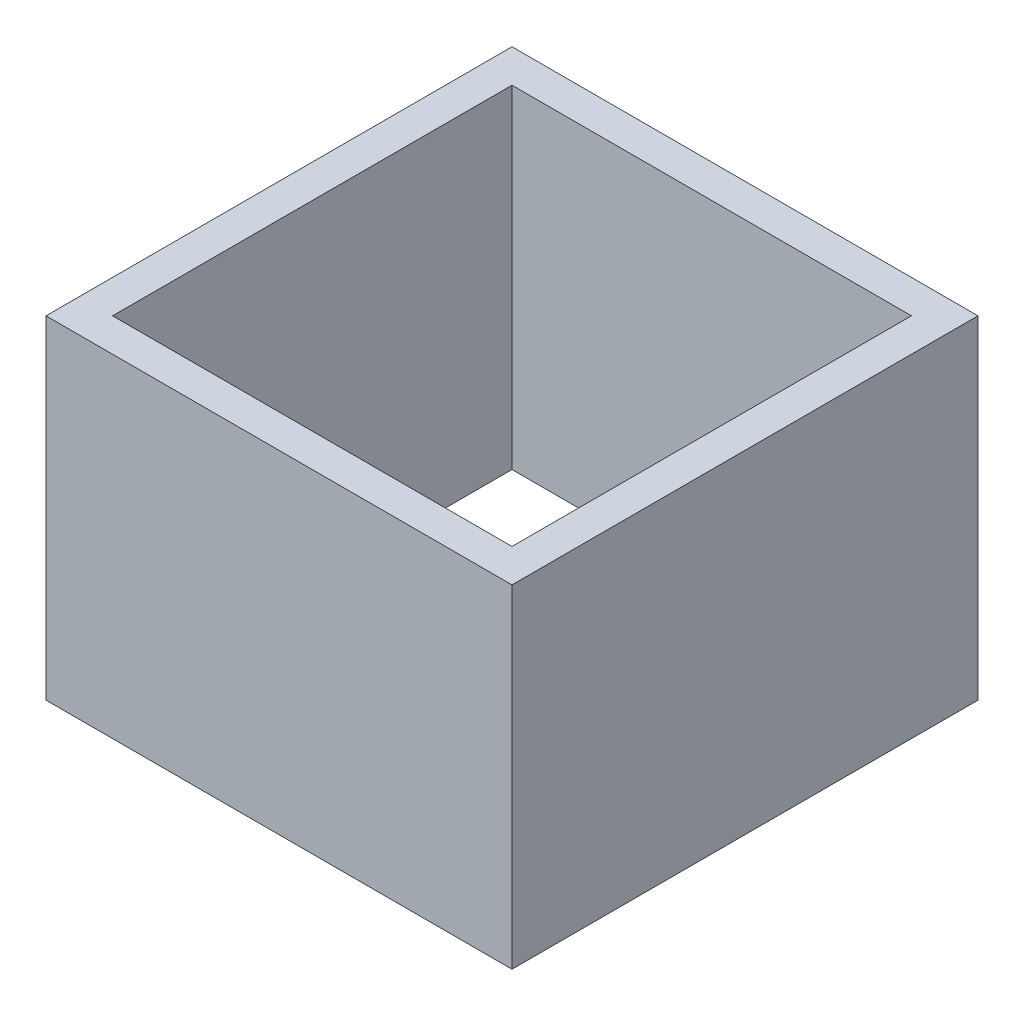
ISO-10303-21;
HEADER;
FILE_DESCRIPTION(('STEP AP214'),'2;1');
FILE_NAME('part.step','',(''),(''),'','','');
FILE_SCHEMA(('AUTOMOTIVE_DESIGN { 1 0 10303 214 1 1 1 1 }'));
ENDSEC;
DATA;
#1=APPLICATION_CONTEXT('core data for automotive mechanical design processes');
#2=APPLICATION_PROTOCOL_DEFINITION('international standard','automotive_design',2000,#1);
#3=PRODUCT_CONTEXT('',#1,'mechanical');
#4=PRODUCT('Part','Part','',(#3));
#5=PRODUCT_RELATED_PRODUCT_CATEGORY('part','',(#4));
#6=PRODUCT_DEFINITION_FORMATION('','',#4);
#7=PRODUCT_DEFINITION_CONTEXT('part definition',#1,'design');
#8=PRODUCT_DEFINITION('design','',#6,#7);
#9=PRODUCT_DEFINITION_SHAPE('','',#8);
#10=(LENGTH_UNIT() NAMED_UNIT(*) SI_UNIT(.MILLI.,.METRE.));
#11=(NAMED_UNIT(*) PLANE_ANGLE_UNIT() SI_UNIT($,.RADIAN.));
#12=(NAMED_UNIT(*) SI_UNIT($,.STERADIAN.) SOLID_ANGLE_UNIT());
#13=UNCERTAINTY_MEASURE_WITH_UNIT(LENGTH_MEASURE(1.E-05),#10,'distance_accuracy_value','');
#14=(GEOMETRIC_REPRESENTATION_CONTEXT(3) GLOBAL_UNCERTAINTY_ASSIGNED_CONTEXT((#13)) GLOBAL_UNIT_ASSIGNED_CONTEXT((#10,
#11,#12)) REPRESENTATION_CONTEXT('',''));
#15=CARTESIAN_POINT('',(0.,0.,0.));
#16=DIRECTION('',(0.,0.,1.));
#17=DIRECTION('',(1.,0.,0.));
#18=AXIS2_PLACEMENT_3D('',#15,#16,#17);
#19=CARTESIAN_POINT('',(0.,63.5,0.));
#20=DIRECTION('',(0.,1.,0.));
#21=DIRECTION('',(0.,0.,1.));
#22=AXIS2_PLACEMENT_3D('',#19,#20,#21);
#23=PLANE('',#22);
#24=DIRECTION('',(0.,0.,-1.));
#25=VECTOR('',#24,1.);
#26=CARTESIAN_POINT('',(44.45,63.5,-44.45));
#27=LINE('',#26,#25);
#28=CARTESIAN_POINT('',(44.45,63.5,44.45));
#29=VERTEX_POINT('',#28);
#30=CARTESIAN_POINT('',(44.45,63.5,-44.45));
#31=VERTEX_POINT('',#30);
#32=EDGE_CURVE('E134',#29,#31,#27,.T.);
#33=ORIENTED_EDGE('',*,*,#32,.T.);
#34=DIRECTION('',(-1.,0.,0.));
#35=VECTOR('',#34,1.);
#36=CARTESIAN_POINT('',(-44.45,63.5,-44.45));
#37=LINE('',#36,#35);
#38=CARTESIAN_POINT('',(-44.45,63.5,-44.45));
#39=VERTEX_POINT('',#38);
#40=EDGE_CURVE('E137',#31,#39,#37,.T.);
#41=ORIENTED_EDGE('',*,*,#40,.T.);
#42=DIRECTION('',(0.,0.,1.));
#43=VECTOR('',#42,1.);
#44=CARTESIAN_POINT('',(-44.45,63.5,-44.45));
#45=LINE('',#44,#43);
#46=CARTESIAN_POINT('',(-44.45,63.5,44.45));
#47=VERTEX_POINT('',#46);
#48=EDGE_CURVE('E140',#39,#47,#45,.T.);
#49=ORIENTED_EDGE('',*,*,#48,.T.);
#50=DIRECTION('',(1.,0.,0.));
#51=VECTOR('',#50,1.);
#52=CARTESIAN_POINT('',(-44.45,63.5,44.45));
#53=LINE('',#52,#51);
#54=EDGE_CURVE('E142',#47,#29,#53,.T.);
#55=ORIENTED_EDGE('',*,*,#54,.T.);
#56=EDGE_LOOP('',(#33,#41,#49,#55));
#57=FACE_BOUND('',#56,.T.);
#58=DIRECTION('',(-1.,0.,0.));
#59=VECTOR('',#58,1.);
#60=CARTESIAN_POINT('',(-38.1,63.5,-38.1));
#61=LINE('',#60,#59);
#62=CARTESIAN_POINT('',(38.1,63.5,-38.1));
#63=VERTEX_POINT('',#62);
#64=CARTESIAN_POINT('',(-38.1,63.5,-38.1));
#65=VERTEX_POINT('',#64);
#66=EDGE_CURVE('E106',#63,#65,#61,.T.);
#67=ORIENTED_EDGE('',*,*,#66,.F.);
#68=DIRECTION('',(0.,0.,-1.));
#69=VECTOR('',#68,1.);
#70=CARTESIAN_POINT('',(38.1,63.5,-38.1));
#71=LINE('',#70,#69);
#72=CARTESIAN_POINT('',(38.1,63.5,38.1));
#73=VERTEX_POINT('',#72);
#74=EDGE_CURVE('E98',#73,#63,#71,.T.);
#75=ORIENTED_EDGE('',*,*,#74,.F.);
#76=DIRECTION('',(1.,0.,0.));
#77=VECTOR('',#76,1.);
#78=CARTESIAN_POINT('',(-38.1,63.5,38.1));
#79=LINE('',#78,#77);
#80=CARTESIAN_POINT('',(-38.1,63.5,38.1));
#81=VERTEX_POINT('',#80);
#82=EDGE_CURVE('E120',#81,#73,#79,.T.);
#83=ORIENTED_EDGE('',*,*,#82,.F.);
#84=DIRECTION('',(0.,0.,1.));
#85=VECTOR('',#84,1.);
#86=CARTESIAN_POINT('',(-38.1,63.5,-38.1));
#87=LINE('',#86,#85);
#88=EDGE_CURVE('E118',#65,#81,#87,.T.);
#89=ORIENTED_EDGE('',*,*,#88,.F.);
#90=EDGE_LOOP('',(#67,#75,#83,#89));
#91=FACE_BOUND('',#90,.T.);
#92=ADVANCED_FACE('F33',(#57,#91),#23,.T.);
#93=CARTESIAN_POINT('',(0.,0.,0.));
#94=DIRECTION('',(0.,1.,0.));
#95=DIRECTION('',(0.,0.,1.));
#96=AXIS2_PLACEMENT_3D('',#93,#94,#95);
#97=PLANE('',#96);
#98=DIRECTION('',(0.,0.,-1.));
#99=VECTOR('',#98,1.);
#100=CARTESIAN_POINT('',(44.45,0.,-44.45));
#101=LINE('',#100,#99);
#102=CARTESIAN_POINT('',(44.45,0.,44.45));
#103=VERTEX_POINT('',#102);
#104=CARTESIAN_POINT('',(44.45,0.,-44.45));
#105=VERTEX_POINT('',#104);
#106=EDGE_CURVE('E114',#103,#105,#101,.T.);
#107=ORIENTED_EDGE('',*,*,#106,.F.);
#108=DIRECTION('',(1.,0.,0.));
#109=VECTOR('',#108,1.);
#110=CARTESIAN_POINT('',(-44.45,0.,44.45));
#111=LINE('',#110,#109);
#112=CARTESIAN_POINT('',(-44.45,0.,44.45));
#113=VERTEX_POINT('',#112);
#114=EDGE_CURVE('E138',#113,#103,#111,.T.);
#115=ORIENTED_EDGE('',*,*,#114,.F.);
#116=DIRECTION('',(0.,0.,1.));
#117=VECTOR('',#116,1.);
#118=CARTESIAN_POINT('',(-44.45,0.,-44.45));
#119=LINE('',#118,#117);
#120=CARTESIAN_POINT('',(-44.45,0.,-44.45));
#121=VERTEX_POINT('',#120);
#122=EDGE_CURVE('E149',#121,#113,#119,.T.);
#123=ORIENTED_EDGE('',*,*,#122,.F.);
#124=DIRECTION('',(-1.,0.,0.));
#125=VECTOR('',#124,1.);
#126=CARTESIAN_POINT('',(-44.45,0.,-44.45));
#127=LINE('',#126,#125);
#128=EDGE_CURVE('E147',#105,#121,#127,.T.);
#129=ORIENTED_EDGE('',*,*,#128,.F.);
#130=EDGE_LOOP('',(#107,#115,#123,#129));
#131=FACE_BOUND('',#130,.T.);
#132=DIRECTION('',(0.,0.,-1.));
#133=VECTOR('',#132,1.);
#134=CARTESIAN_POINT('',(38.1,0.,-38.1));
#135=LINE('',#134,#133);
#136=CARTESIAN_POINT('',(38.1,0.,38.1));
#137=VERTEX_POINT('',#136);
#138=CARTESIAN_POINT('',(38.1,0.,-38.1));
#139=VERTEX_POINT('',#138);
#140=EDGE_CURVE('E56',#137,#139,#135,.T.);
#141=ORIENTED_EDGE('',*,*,#140,.T.);
#142=DIRECTION('',(-1.,0.,0.));
#143=VECTOR('',#142,1.);
#144=CARTESIAN_POINT('',(-38.1,0.,-38.1));
#145=LINE('',#144,#143);
#146=CARTESIAN_POINT('',(-38.1,0.,-38.1));
#147=VERTEX_POINT('',#146);
#148=EDGE_CURVE('E113',#139,#147,#145,.T.);
#149=ORIENTED_EDGE('',*,*,#148,.T.);
#150=DIRECTION('',(0.,0.,1.));
#151=VECTOR('',#150,1.);
#152=CARTESIAN_POINT('',(-38.1,0.,-38.1));
#153=LINE('',#152,#151);
#154=CARTESIAN_POINT('',(-38.1,0.,38.1));
#155=VERTEX_POINT('',#154);
#156=EDGE_CURVE('E126',#147,#155,#153,.T.);
#157=ORIENTED_EDGE('',*,*,#156,.T.);
#158=DIRECTION('',(1.,0.,0.));
#159=VECTOR('',#158,1.);
#160=CARTESIAN_POINT('',(-38.1,0.,38.1));
#161=LINE('',#160,#159);
#162=EDGE_CURVE('E107',#155,#137,#161,.T.);
#163=ORIENTED_EDGE('',*,*,#162,.T.);
#164=EDGE_LOOP('',(#141,#149,#157,#163));
#165=FACE_BOUND('',#164,.T.);
#166=ADVANCED_FACE('F167',(#131,#165),#97,.F.);
#167=CARTESIAN_POINT('',(44.45,63.5,-44.45));
#168=DIRECTION('',(-1.,0.,0.));
#169=DIRECTION('',(0.,0.,1.));
#170=AXIS2_PLACEMENT_3D('',#167,#168,#169);
#171=PLANE('',#170);
#172=ORIENTED_EDGE('',*,*,#106,.T.);
#173=DIRECTION('',(0.,-1.,0.));
#174=VECTOR('',#173,1.);
#175=CARTESIAN_POINT('',(44.45,63.5,-44.45));
#176=LINE('',#175,#174);
#177=EDGE_CURVE('E11',#31,#105,#176,.T.);
#178=ORIENTED_EDGE('',*,*,#177,.F.);
#179=ORIENTED_EDGE('',*,*,#32,.F.);
#180=DIRECTION('',(0.,-1.,0.));
#181=VECTOR('',#180,1.);
#182=CARTESIAN_POINT('',(44.45,63.5,44.45));
#183=LINE('',#182,#181);
#184=EDGE_CURVE('E144',#29,#103,#183,.T.);
#185=ORIENTED_EDGE('',*,*,#184,.T.);
#186=EDGE_LOOP('',(#172,#178,#179,#185));
#187=FACE_BOUND('',#186,.T.);
#188=ADVANCED_FACE('F35',(#187),#171,.F.);
#189=CARTESIAN_POINT('',(-44.45,63.5,-44.45));
#190=DIRECTION('',(0.,0.,1.));
#191=DIRECTION('',(1.,0.,0.));
#192=AXIS2_PLACEMENT_3D('',#189,#190,#191);
#193=PLANE('',#192);
#194=ORIENTED_EDGE('',*,*,#128,.T.);
#195=DIRECTION('',(0.,-1.,0.));
#196=VECTOR('',#195,1.);
#197=CARTESIAN_POINT('',(-44.45,63.5,-44.45));
#198=LINE('',#197,#196);
#199=EDGE_CURVE('E41',#39,#121,#198,.T.);
#200=ORIENTED_EDGE('',*,*,#199,.F.);
#201=ORIENTED_EDGE('',*,*,#40,.F.);
#202=ORIENTED_EDGE('',*,*,#177,.T.);
#203=EDGE_LOOP('',(#194,#200,#201,#202));
#204=FACE_BOUND('',#203,.T.);
#205=ADVANCED_FACE('F177',(#204),#193,.F.);
#206=CARTESIAN_POINT('',(-44.45,63.5,-44.45));
#207=DIRECTION('',(1.,0.,0.));
#208=DIRECTION('',(0.,0.,-1.));
#209=AXIS2_PLACEMENT_3D('',#206,#207,#208);
#210=PLANE('',#209);
#211=ORIENTED_EDGE('',*,*,#122,.T.);
#212=DIRECTION('',(0.,-1.,0.));
#213=VECTOR('',#212,1.);
#214=CARTESIAN_POINT('',(-44.45,63.5,44.45));
#215=LINE('',#214,#213);
#216=EDGE_CURVE('E154',#47,#113,#215,.T.);
#217=ORIENTED_EDGE('',*,*,#216,.F.);
#218=ORIENTED_EDGE('',*,*,#48,.F.);
#219=ORIENTED_EDGE('',*,*,#199,.T.);
#220=EDGE_LOOP('',(#211,#217,#218,#219));
#221=FACE_BOUND('',#220,.T.);
#222=ADVANCED_FACE('F161',(#221),#210,.F.);
#223=CARTESIAN_POINT('',(-44.45,63.5,44.45));
#224=DIRECTION('',(0.,0.,-1.));
#225=DIRECTION('',(-1.,0.,0.));
#226=AXIS2_PLACEMENT_3D('',#223,#224,#225);
#227=PLANE('',#226);
#228=ORIENTED_EDGE('',*,*,#114,.T.);
#229=ORIENTED_EDGE('',*,*,#184,.F.);
#230=ORIENTED_EDGE('',*,*,#54,.F.);
#231=ORIENTED_EDGE('',*,*,#216,.T.);
#232=EDGE_LOOP('',(#228,#229,#230,#231));
#233=FACE_BOUND('',#232,.T.);
#234=ADVANCED_FACE('F171',(#233),#227,.F.);
#235=CARTESIAN_POINT('',(38.1,63.5,-38.1));
#236=DIRECTION('',(-1.,0.,0.));
#237=DIRECTION('',(0.,0.,1.));
#238=AXIS2_PLACEMENT_3D('',#235,#236,#237);
#239=PLANE('',#238);
#240=ORIENTED_EDGE('',*,*,#140,.F.);
#241=DIRECTION('',(0.,-1.,0.));
#242=VECTOR('',#241,1.);
#243=CARTESIAN_POINT('',(38.1,63.5,38.1));
#244=LINE('',#243,#242);
#245=EDGE_CURVE('E102',#73,#137,#244,.T.);
#246=ORIENTED_EDGE('',*,*,#245,.F.);
#247=ORIENTED_EDGE('',*,*,#74,.T.);
#248=DIRECTION('',(0.,-1.,0.));
#249=VECTOR('',#248,1.);
#250=CARTESIAN_POINT('',(38.1,63.5,-38.1));
#251=LINE('',#250,#249);
#252=EDGE_CURVE('E101',#63,#139,#251,.T.);
#253=ORIENTED_EDGE('',*,*,#252,.T.);
#254=EDGE_LOOP('',(#240,#246,#247,#253));
#255=FACE_BOUND('',#254,.T.);
#256=ADVANCED_FACE('F100',(#255),#239,.T.);
#257=CARTESIAN_POINT('',(-38.1,63.5,-38.1));
#258=DIRECTION('',(0.,0.,1.));
#259=DIRECTION('',(1.,0.,0.));
#260=AXIS2_PLACEMENT_3D('',#257,#258,#259);
#261=PLANE('',#260);
#262=ORIENTED_EDGE('',*,*,#148,.F.);
#263=ORIENTED_EDGE('',*,*,#252,.F.);
#264=ORIENTED_EDGE('',*,*,#66,.T.);
#265=DIRECTION('',(0.,-1.,0.));
#266=VECTOR('',#265,1.);
#267=CARTESIAN_POINT('',(-38.1,63.5,-38.1));
#268=LINE('',#267,#266);
#269=EDGE_CURVE('E115',#65,#147,#268,.T.);
#270=ORIENTED_EDGE('',*,*,#269,.T.);
#271=EDGE_LOOP('',(#262,#263,#264,#270));
#272=FACE_BOUND('',#271,.T.);
#273=ADVANCED_FACE('F110',(#272),#261,.T.);
#274=CARTESIAN_POINT('',(-38.1,63.5,-38.1));
#275=DIRECTION('',(1.,0.,0.));
#276=DIRECTION('',(0.,0.,-1.));
#277=AXIS2_PLACEMENT_3D('',#274,#275,#276);
#278=PLANE('',#277);
#279=ORIENTED_EDGE('',*,*,#156,.F.);
#280=ORIENTED_EDGE('',*,*,#269,.F.);
#281=ORIENTED_EDGE('',*,*,#88,.T.);
#282=DIRECTION('',(0.,-1.,0.));
#283=VECTOR('',#282,1.);
#284=CARTESIAN_POINT('',(-38.1,63.5,38.1));
#285=LINE('',#284,#283);
#286=EDGE_CURVE('E48',#81,#155,#285,.T.);
#287=ORIENTED_EDGE('',*,*,#286,.T.);
#288=EDGE_LOOP('',(#279,#280,#281,#287));
#289=FACE_BOUND('',#288,.T.);
#290=ADVANCED_FACE('F200',(#289),#278,.T.);
#291=CARTESIAN_POINT('',(-38.1,63.5,38.1));
#292=DIRECTION('',(0.,0.,-1.));
#293=DIRECTION('',(-1.,0.,0.));
#294=AXIS2_PLACEMENT_3D('',#291,#292,#293);
#295=PLANE('',#294);
#296=ORIENTED_EDGE('',*,*,#162,.F.);
#297=ORIENTED_EDGE('',*,*,#286,.F.);
#298=ORIENTED_EDGE('',*,*,#82,.T.);
#299=ORIENTED_EDGE('',*,*,#245,.T.);
#300=EDGE_LOOP('',(#296,#297,#298,#299));
#301=FACE_BOUND('',#300,.T.);
#302=ADVANCED_FACE('F204',(#301),#295,.T.);
#303=CLOSED_SHELL('',(#92,#166,#188,#205,#222,#234,#256,#273,#290,#302));
#304=MANIFOLD_SOLID_BREP('B2',#303);
#305=ADVANCED_BREP_SHAPE_REPRESENTATION('',(#18,#304),#14);
#306=SHAPE_DEFINITION_REPRESENTATION(#9,#305);
ENDSEC;
END-ISO-10303-21;
